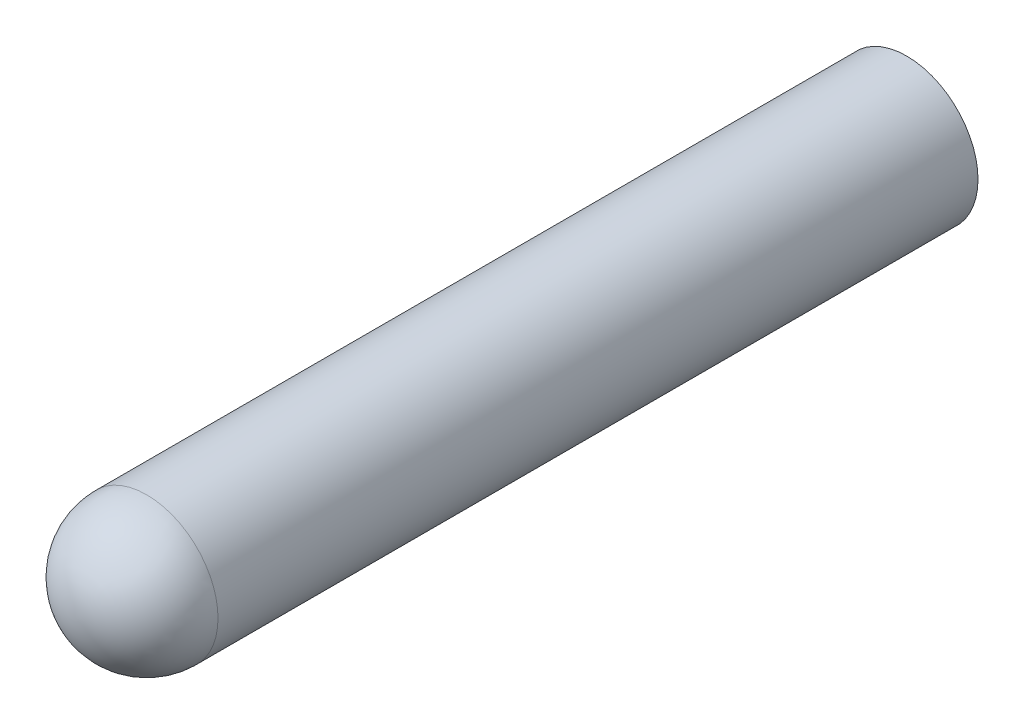
ISO-10303-21;
HEADER;
FILE_DESCRIPTION(('STEP AP214'),'2;1');
FILE_NAME('part.step','',(''),(''),'','','');
FILE_SCHEMA(('AUTOMOTIVE_DESIGN { 1 0 10303 214 1 1 1 1 }'));
ENDSEC;
DATA;
#1=APPLICATION_CONTEXT('core data for automotive mechanical design processes');
#2=APPLICATION_PROTOCOL_DEFINITION('international standard','automotive_design',2000,#1);
#3=PRODUCT_CONTEXT('',#1,'mechanical');
#4=PRODUCT('Part','Part','',(#3));
#5=PRODUCT_RELATED_PRODUCT_CATEGORY('part','',(#4));
#6=PRODUCT_DEFINITION_FORMATION('','',#4);
#7=PRODUCT_DEFINITION_CONTEXT('part definition',#1,'design');
#8=PRODUCT_DEFINITION('design','',#6,#7);
#9=PRODUCT_DEFINITION_SHAPE('','',#8);
#10=(LENGTH_UNIT() NAMED_UNIT(*) SI_UNIT(.MILLI.,.METRE.));
#11=(NAMED_UNIT(*) PLANE_ANGLE_UNIT() SI_UNIT($,.RADIAN.));
#12=(NAMED_UNIT(*) SI_UNIT($,.STERADIAN.) SOLID_ANGLE_UNIT());
#13=UNCERTAINTY_MEASURE_WITH_UNIT(LENGTH_MEASURE(1.E-05),#10,'distance_accuracy_value','');
#14=(GEOMETRIC_REPRESENTATION_CONTEXT(3) GLOBAL_UNCERTAINTY_ASSIGNED_CONTEXT((#13)) GLOBAL_UNIT_ASSIGNED_CONTEXT((#10,
#11,#12)) REPRESENTATION_CONTEXT('',''));
#15=CARTESIAN_POINT('',(0.,0.,0.));
#16=DIRECTION('',(0.,0.,1.));
#17=DIRECTION('',(1.,0.,0.));
#18=AXIS2_PLACEMENT_3D('',#15,#16,#17);
#19=CARTESIAN_POINT('',(407.647776255864,485.203130924553,35.));
#20=DIRECTION('',(0.,0.,-1.));
#21=DIRECTION('',(-1.,0.,0.));
#22=AXIS2_PLACEMENT_3D('',#19,#20,#21);
#23=CYLINDRICAL_SURFACE('',#22,2.99999999999999);
#24=CARTESIAN_POINT('',(407.647776255864,485.203130924553,32.));
#25=DIRECTION('',(0.,0.,-1.));
#26=DIRECTION('',(-1.,0.,0.));
#27=AXIS2_PLACEMENT_3D('',#24,#25,#26);
#28=CIRCLE('',#27,2.99999999999999);
#29=CARTESIAN_POINT('',(404.647776255864,485.203130924553,32.));
#30=VERTEX_POINT('',#29);
#31=EDGE_CURVE('E10',#30,#30,#28,.T.);
#32=ORIENTED_EDGE('',*,*,#31,.T.);
#33=EDGE_LOOP('',(#32));
#34=FACE_BOUND('',#33,.T.);
#35=CARTESIAN_POINT('',(407.647776255864,485.203130924553,0.));
#36=DIRECTION('',(0.,0.,1.));
#37=DIRECTION('',(1.,0.,0.));
#38=AXIS2_PLACEMENT_3D('',#35,#36,#37);
#39=CIRCLE('',#38,2.99999999999999);
#40=CARTESIAN_POINT('',(410.647776255864,485.203130924553,0.));
#41=VERTEX_POINT('',#40);
#42=EDGE_CURVE('E42',#41,#41,#39,.T.);
#43=ORIENTED_EDGE('',*,*,#42,.T.);
#44=EDGE_LOOP('',(#43));
#45=FACE_BOUND('',#44,.T.);
#46=ADVANCED_FACE('F40',(#34,#45),#23,.T.);
#47=CARTESIAN_POINT('',(407.647776255864,485.203130924553,0.));
#48=DIRECTION('',(0.,0.,1.));
#49=DIRECTION('',(1.,0.,0.));
#50=AXIS2_PLACEMENT_3D('',#47,#48,#49);
#51=PLANE('',#50);
#52=CARTESIAN_POINT('',(407.647776255864,485.203130924553,0.));
#53=DIRECTION('',(0.,0.,-1.));
#54=DIRECTION('',(-1.,0.,0.));
#55=AXIS2_PLACEMENT_3D('',#52,#53,#54);
#56=CIRCLE('',#55,1.50000000000002);
#57=CARTESIAN_POINT('',(406.147776255864,485.203130924553,0.));
#58=VERTEX_POINT('',#57);
#59=EDGE_CURVE('E55',#58,#58,#56,.T.);
#60=ORIENTED_EDGE('',*,*,#59,.F.);
#61=EDGE_LOOP('',(#60));
#62=FACE_BOUND('',#61,.T.);
#63=ORIENTED_EDGE('',*,*,#42,.F.);
#64=EDGE_LOOP('',(#63));
#65=FACE_BOUND('',#64,.T.);
#66=ADVANCED_FACE('F58',(#62,#65),#51,.F.);
#67=CARTESIAN_POINT('',(407.647776255864,485.203130924553,32.));
#68=DIRECTION('',(0.,0.,1.));
#69=DIRECTION('',(1.,0.,0.));
#70=AXIS2_PLACEMENT_3D('',#67,#68,#69);
#71=SPHERICAL_SURFACE('',#70,3.);
#72=ORIENTED_EDGE('',*,*,#31,.F.);
#73=EDGE_LOOP('',(#72));
#74=FACE_BOUND('',#73,.T.);
#75=ADVANCED_FACE('F39',(#74),#71,.T.);
#76=CARTESIAN_POINT('',(407.647776255864,485.203130924553,5.));
#77=DIRECTION('',(0.,0.,-1.));
#78=DIRECTION('',(-1.,0.,0.));
#79=AXIS2_PLACEMENT_3D('',#76,#77,#78);
#80=CYLINDRICAL_SURFACE('',#79,1.50000000000002);
#81=CARTESIAN_POINT('',(407.647776255864,485.203130924553,5.));
#82=DIRECTION('',(0.,0.,-1.));
#83=DIRECTION('',(-1.,0.,0.));
#84=AXIS2_PLACEMENT_3D('',#81,#82,#83);
#85=CIRCLE('',#84,1.50000000000002);
#86=CARTESIAN_POINT('',(406.147776255864,485.203130924553,5.));
#87=VERTEX_POINT('',#86);
#88=EDGE_CURVE('E48',#87,#87,#85,.T.);
#89=ORIENTED_EDGE('',*,*,#88,.F.);
#90=EDGE_LOOP('',(#89));
#91=FACE_BOUND('',#90,.T.);
#92=ORIENTED_EDGE('',*,*,#59,.T.);
#93=EDGE_LOOP('',(#92));
#94=FACE_BOUND('',#93,.T.);
#95=ADVANCED_FACE('F59',(#91,#94),#80,.F.);
#96=CARTESIAN_POINT('',(407.647776255864,485.203130924553,5.));
#97=DIRECTION('',(0.,0.,-1.));
#98=DIRECTION('',(-1.,0.,0.));
#99=AXIS2_PLACEMENT_3D('',#96,#97,#98);
#100=PLANE('',#99);
#101=ORIENTED_EDGE('',*,*,#88,.T.);
#102=EDGE_LOOP('',(#101));
#103=FACE_BOUND('',#102,.T.);
#104=ADVANCED_FACE('F75',(#103),#100,.T.);
#105=CLOSED_SHELL('',(#46,#66,#75,#95,#104));
#106=MANIFOLD_SOLID_BREP('B2',#105);
#107=ADVANCED_BREP_SHAPE_REPRESENTATION('',(#18,#106),#14);
#108=SHAPE_DEFINITION_REPRESENTATION(#9,#107);
ENDSEC;
END-ISO-10303-21;
